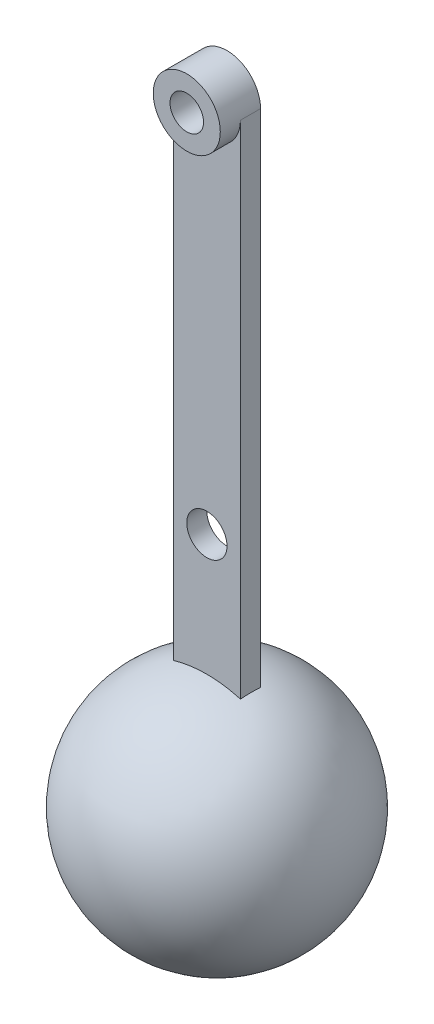
ISO-10303-21;
HEADER;
FILE_DESCRIPTION(('STEP AP214'),'2;1');
FILE_NAME('part.step','',(''),(''),'','','');
FILE_SCHEMA(('AUTOMOTIVE_DESIGN { 1 0 10303 214 1 1 1 1 }'));
ENDSEC;
DATA;
#1=APPLICATION_CONTEXT('core data for automotive mechanical design processes');
#2=APPLICATION_PROTOCOL_DEFINITION('international standard','automotive_design',2000,#1);
#3=PRODUCT_CONTEXT('',#1,'mechanical');
#4=PRODUCT('Part','Part','',(#3));
#5=PRODUCT_RELATED_PRODUCT_CATEGORY('part','',(#4));
#6=PRODUCT_DEFINITION_FORMATION('','',#4);
#7=PRODUCT_DEFINITION_CONTEXT('part definition',#1,'design');
#8=PRODUCT_DEFINITION('design','',#6,#7);
#9=PRODUCT_DEFINITION_SHAPE('','',#8);
#10=(LENGTH_UNIT() NAMED_UNIT(*) SI_UNIT(.MILLI.,.METRE.));
#11=(NAMED_UNIT(*) PLANE_ANGLE_UNIT() SI_UNIT($,.RADIAN.));
#12=(NAMED_UNIT(*) SI_UNIT($,.STERADIAN.) SOLID_ANGLE_UNIT());
#13=UNCERTAINTY_MEASURE_WITH_UNIT(LENGTH_MEASURE(1.E-05),#10,'distance_accuracy_value','');
#14=(GEOMETRIC_REPRESENTATION_CONTEXT(3) GLOBAL_UNCERTAINTY_ASSIGNED_CONTEXT((#13)) GLOBAL_UNIT_ASSIGNED_CONTEXT((#10,
#11,#12)) REPRESENTATION_CONTEXT('',''));
#15=CARTESIAN_POINT('',(0.,0.,0.));
#16=DIRECTION('',(0.,0.,1.));
#17=DIRECTION('',(1.,0.,0.));
#18=AXIS2_PLACEMENT_3D('',#15,#16,#17);
#19=CARTESIAN_POINT('',(-2.5,0.,0.75));
#20=DIRECTION('',(1.,0.,0.));
#21=DIRECTION('',(0.,0.,-1.));
#22=AXIS2_PLACEMENT_3D('',#19,#20,#21);
#23=PLANE('',#22);
#24=CARTESIAN_POINT('',(-2.5,0.,0.));
#25=DIRECTION('',(1.,0.,0.));
#26=DIRECTION('',(0.,0.,-1.));
#27=AXIS2_PLACEMENT_3D('',#24,#25,#26);
#28=CIRCLE('',#27,8.64580823289529);
#29=CARTESIAN_POINT('',(-2.5,8.61321658847611,0.75));
#30=VERTEX_POINT('',#29);
#31=CARTESIAN_POINT('',(-2.5,8.61321658847611,-0.75));
#32=VERTEX_POINT('',#31);
#33=EDGE_CURVE('E56',#30,#32,#28,.F.);
#34=ORIENTED_EDGE('',*,*,#33,.F.);
#35=DIRECTION('',(0.,-1.,0.));
#36=VECTOR('',#35,1.);
#37=CARTESIAN_POINT('',(-2.5,0.,0.75));
#38=LINE('',#37,#36);
#39=CARTESIAN_POINT('',(-2.5,46.,0.75));
#40=VERTEX_POINT('',#39);
#41=EDGE_CURVE('E104',#40,#30,#38,.T.);
#42=ORIENTED_EDGE('',*,*,#41,.F.);
#43=DIRECTION('',(0.,0.,-1.));
#44=VECTOR('',#43,1.);
#45=CARTESIAN_POINT('',(-2.5,46.,0.75));
#46=LINE('',#45,#44);
#47=CARTESIAN_POINT('',(-2.5,46.,-0.75));
#48=VERTEX_POINT('',#47);
#49=EDGE_CURVE('E91',#40,#48,#46,.T.);
#50=ORIENTED_EDGE('',*,*,#49,.T.);
#51=DIRECTION('',(0.,-1.,0.));
#52=VECTOR('',#51,1.);
#53=CARTESIAN_POINT('',(-2.5,0.,-0.75));
#54=LINE('',#53,#52);
#55=EDGE_CURVE('E102',#48,#32,#54,.T.);
#56=ORIENTED_EDGE('',*,*,#55,.T.);
#57=EDGE_LOOP('',(#34,#42,#50,#56));
#58=FACE_BOUND('',#57,.T.);
#59=ADVANCED_FACE('F47',(#58),#23,.F.);
#60=CARTESIAN_POINT('',(0.,18.,0.75));
#61=DIRECTION('',(0.,0.,-1.));
#62=DIRECTION('',(-1.,0.,0.));
#63=AXIS2_PLACEMENT_3D('',#60,#61,#62);
#64=CYLINDRICAL_SURFACE('',#63,1.5);
#65=CARTESIAN_POINT('',(0.,18.,0.75));
#66=DIRECTION('',(0.,0.,1.));
#67=DIRECTION('',(1.,0.,0.));
#68=AXIS2_PLACEMENT_3D('',#65,#66,#67);
#69=CIRCLE('',#68,1.5);
#70=CARTESIAN_POINT('',(1.5,18.,0.75));
#71=VERTEX_POINT('',#70);
#72=EDGE_CURVE('E117',#71,#71,#69,.T.);
#73=ORIENTED_EDGE('',*,*,#72,.T.);
#74=EDGE_LOOP('',(#73));
#75=FACE_BOUND('',#74,.T.);
#76=CARTESIAN_POINT('',(0.,18.,-0.75));
#77=DIRECTION('',(0.,0.,1.));
#78=DIRECTION('',(1.,0.,0.));
#79=AXIS2_PLACEMENT_3D('',#76,#77,#78);
#80=CIRCLE('',#79,1.5);
#81=CARTESIAN_POINT('',(1.5,18.,-0.75));
#82=VERTEX_POINT('',#81);
#83=EDGE_CURVE('E113',#82,#82,#80,.T.);
#84=ORIENTED_EDGE('',*,*,#83,.F.);
#85=EDGE_LOOP('',(#84));
#86=FACE_BOUND('',#85,.T.);
#87=ADVANCED_FACE('F171',(#75,#86),#64,.F.);
#88=CARTESIAN_POINT('',(2.5,0.,0.75));
#89=DIRECTION('',(1.,0.,0.));
#90=DIRECTION('',(0.,1.,0.));
#91=AXIS2_PLACEMENT_3D('',#88,#89,#90);
#92=PLANE('',#91);
#93=DIRECTION('',(0.,-1.,0.));
#94=VECTOR('',#93,1.);
#95=CARTESIAN_POINT('',(2.5,0.,0.75));
#96=LINE('',#95,#94);
#97=CARTESIAN_POINT('',(2.49999999999999,46.,0.75));
#98=VERTEX_POINT('',#97);
#99=CARTESIAN_POINT('',(2.5,8.61321658847611,0.75));
#100=VERTEX_POINT('',#99);
#101=EDGE_CURVE('E125',#98,#100,#96,.T.);
#102=ORIENTED_EDGE('',*,*,#101,.T.);
#103=CARTESIAN_POINT('',(2.5,0.,0.));
#104=DIRECTION('',(1.,0.,0.));
#105=DIRECTION('',(0.,1.,0.));
#106=AXIS2_PLACEMENT_3D('',#103,#104,#105);
#107=CIRCLE('',#106,8.64580823289529);
#108=CARTESIAN_POINT('',(2.5,8.61321658847611,-0.75));
#109=VERTEX_POINT('',#108);
#110=EDGE_CURVE('E129',#100,#109,#107,.F.);
#111=ORIENTED_EDGE('',*,*,#110,.T.);
#112=DIRECTION('',(0.,-1.,0.));
#113=VECTOR('',#112,1.);
#114=CARTESIAN_POINT('',(2.5,0.,-0.75));
#115=LINE('',#114,#113);
#116=CARTESIAN_POINT('',(2.5,46.,-0.75));
#117=VERTEX_POINT('',#116);
#118=EDGE_CURVE('E63',#117,#109,#115,.T.);
#119=ORIENTED_EDGE('',*,*,#118,.F.);
#120=DIRECTION('',(0.,0.,-1.));
#121=VECTOR('',#120,1.);
#122=CARTESIAN_POINT('',(2.5,46.,0.75));
#123=LINE('',#122,#121);
#124=EDGE_CURVE('E94',#98,#117,#123,.T.);
#125=ORIENTED_EDGE('',*,*,#124,.F.);
#126=EDGE_LOOP('',(#102,#111,#119,#125));
#127=FACE_BOUND('',#126,.T.);
#128=ADVANCED_FACE('F176',(#127),#92,.T.);
#129=CARTESIAN_POINT('',(0.,0.,0.75));
#130=DIRECTION('',(0.,0.,1.));
#131=DIRECTION('',(1.,0.,0.));
#132=AXIS2_PLACEMENT_3D('',#129,#130,#131);
#133=PLANE('',#132);
#134=ORIENTED_EDGE('',*,*,#72,.F.);
#135=EDGE_LOOP('',(#134));
#136=FACE_BOUND('',#135,.T.);
#137=ORIENTED_EDGE('',*,*,#41,.T.);
#138=CARTESIAN_POINT('',(0.,0.,0.75));
#139=DIRECTION('',(0.,0.,1.));
#140=DIRECTION('',(1.,0.,0.));
#141=AXIS2_PLACEMENT_3D('',#138,#139,#140);
#142=CIRCLE('',#141,8.96869555732605);
#143=EDGE_CURVE('E11',#30,#100,#142,.F.);
#144=ORIENTED_EDGE('',*,*,#143,.T.);
#145=ORIENTED_EDGE('',*,*,#101,.F.);
#146=CARTESIAN_POINT('',(0.,46.,0.75));
#147=DIRECTION('',(0.,0.,1.));
#148=DIRECTION('',(1.,0.,0.));
#149=AXIS2_PLACEMENT_3D('',#146,#147,#148);
#150=CIRCLE('',#149,2.5);
#151=EDGE_CURVE('E135',#40,#98,#150,.T.);
#152=ORIENTED_EDGE('',*,*,#151,.F.);
#153=EDGE_LOOP('',(#137,#144,#145,#152));
#154=FACE_BOUND('',#153,.T.);
#155=ADVANCED_FACE('F134',(#136,#154),#133,.T.);
#156=CARTESIAN_POINT('',(0.,0.,-0.75));
#157=DIRECTION('',(0.,0.,1.));
#158=DIRECTION('',(1.,0.,0.));
#159=AXIS2_PLACEMENT_3D('',#156,#157,#158);
#160=PLANE('',#159);
#161=CARTESIAN_POINT('',(0.,0.,-0.75));
#162=DIRECTION('',(0.,0.,1.));
#163=DIRECTION('',(1.,0.,0.));
#164=AXIS2_PLACEMENT_3D('',#161,#162,#163);
#165=CIRCLE('',#164,8.96869555732605);
#166=EDGE_CURVE('E107',#32,#109,#165,.F.);
#167=ORIENTED_EDGE('',*,*,#166,.F.);
#168=ORIENTED_EDGE('',*,*,#55,.F.);
#169=CARTESIAN_POINT('',(0.,46.,-0.75));
#170=DIRECTION('',(0.,0.,1.));
#171=DIRECTION('',(1.,0.,0.));
#172=AXIS2_PLACEMENT_3D('',#169,#170,#171);
#173=CIRCLE('',#172,2.5);
#174=EDGE_CURVE('E88',#117,#48,#173,.T.);
#175=ORIENTED_EDGE('',*,*,#174,.F.);
#176=ORIENTED_EDGE('',*,*,#118,.T.);
#177=EDGE_LOOP('',(#167,#168,#175,#176));
#178=FACE_BOUND('',#177,.T.);
#179=ORIENTED_EDGE('',*,*,#83,.T.);
#180=EDGE_LOOP('',(#179));
#181=FACE_BOUND('',#180,.T.);
#182=CARTESIAN_POINT('',(0.,46.,-0.75));
#183=DIRECTION('',(0.,0.,1.));
#184=DIRECTION('',(1.,0.,0.));
#185=AXIS2_PLACEMENT_3D('',#182,#183,#184);
#186=CIRCLE('',#185,1.25);
#187=CARTESIAN_POINT('',(1.25,46.,-0.75));
#188=VERTEX_POINT('',#187);
#189=EDGE_CURVE('E98',#188,#188,#186,.T.);
#190=ORIENTED_EDGE('',*,*,#189,.T.);
#191=EDGE_LOOP('',(#190));
#192=FACE_BOUND('',#191,.T.);
#193=ADVANCED_FACE('F109',(#178,#181,#192),#160,.F.);
#194=CARTESIAN_POINT('',(0.,0.,0.));
#195=DIRECTION('',(0.,1.,0.));
#196=DIRECTION('',(1.,0.,0.));
#197=AXIS2_PLACEMENT_3D('',#194,#195,#196);
#198=SPHERICAL_SURFACE('',#197,9.);
#199=ORIENTED_EDGE('',*,*,#143,.F.);
#200=ORIENTED_EDGE('',*,*,#33,.T.);
#201=ORIENTED_EDGE('',*,*,#166,.T.);
#202=ORIENTED_EDGE('',*,*,#110,.F.);
#203=EDGE_LOOP('',(#199,#200,#201,#202));
#204=FACE_BOUND('',#203,.T.);
#205=ADVANCED_FACE('F49',(#204),#198,.T.);
#206=CARTESIAN_POINT('',(0.,46.,2.25));
#207=DIRECTION('',(0.,0.,-1.));
#208=DIRECTION('',(-1.,0.,0.));
#209=AXIS2_PLACEMENT_3D('',#206,#207,#208);
#210=CYLINDRICAL_SURFACE('',#209,2.5);
#211=CARTESIAN_POINT('',(0.,46.,2.25));
#212=DIRECTION('',(0.,0.,1.));
#213=DIRECTION('',(1.,0.,0.));
#214=AXIS2_PLACEMENT_3D('',#211,#212,#213);
#215=CIRCLE('',#214,2.5);
#216=CARTESIAN_POINT('',(2.5,46.,2.25));
#217=VERTEX_POINT('',#216);
#218=EDGE_CURVE('E120',#217,#217,#215,.T.);
#219=ORIENTED_EDGE('',*,*,#218,.F.);
#220=EDGE_LOOP('',(#219));
#221=FACE_BOUND('',#220,.T.);
#222=ORIENTED_EDGE('',*,*,#174,.T.);
#223=ORIENTED_EDGE('',*,*,#49,.F.);
#224=ORIENTED_EDGE('',*,*,#151,.T.);
#225=ORIENTED_EDGE('',*,*,#124,.T.);
#226=EDGE_LOOP('',(#222,#223,#224,#225));
#227=FACE_BOUND('',#226,.T.);
#228=ADVANCED_FACE('F90',(#221,#227),#210,.T.);
#229=CARTESIAN_POINT('',(0.,46.,2.25));
#230=DIRECTION('',(0.,0.,-1.));
#231=DIRECTION('',(-1.,0.,0.));
#232=AXIS2_PLACEMENT_3D('',#229,#230,#231);
#233=CYLINDRICAL_SURFACE('',#232,1.25);
#234=CARTESIAN_POINT('',(0.,46.,2.25));
#235=DIRECTION('',(0.,0.,1.));
#236=DIRECTION('',(1.,0.,0.));
#237=AXIS2_PLACEMENT_3D('',#234,#235,#236);
#238=CIRCLE('',#237,1.25);
#239=CARTESIAN_POINT('',(1.25,46.,2.25));
#240=VERTEX_POINT('',#239);
#241=EDGE_CURVE('E97',#240,#240,#238,.T.);
#242=ORIENTED_EDGE('',*,*,#241,.T.);
#243=EDGE_LOOP('',(#242));
#244=FACE_BOUND('',#243,.T.);
#245=ORIENTED_EDGE('',*,*,#189,.F.);
#246=EDGE_LOOP('',(#245));
#247=FACE_BOUND('',#246,.T.);
#248=ADVANCED_FACE('F156',(#244,#247),#233,.F.);
#249=CARTESIAN_POINT('',(0.,0.,2.25));
#250=DIRECTION('',(0.,0.,1.));
#251=DIRECTION('',(1.,0.,0.));
#252=AXIS2_PLACEMENT_3D('',#249,#250,#251);
#253=PLANE('',#252);
#254=ORIENTED_EDGE('',*,*,#241,.F.);
#255=EDGE_LOOP('',(#254));
#256=FACE_BOUND('',#255,.T.);
#257=ORIENTED_EDGE('',*,*,#218,.T.);
#258=EDGE_LOOP('',(#257));
#259=FACE_BOUND('',#258,.T.);
#260=ADVANCED_FACE('F158',(#256,#259),#253,.T.);
#261=CLOSED_SHELL('',(#59,#87,#128,#155,#193,#205,#228,#248,#260));
#262=MANIFOLD_SOLID_BREP('B2',#261);
#263=ADVANCED_BREP_SHAPE_REPRESENTATION('',(#18,#262),#14);
#264=SHAPE_DEFINITION_REPRESENTATION(#9,#263);
ENDSEC;
END-ISO-10303-21;
